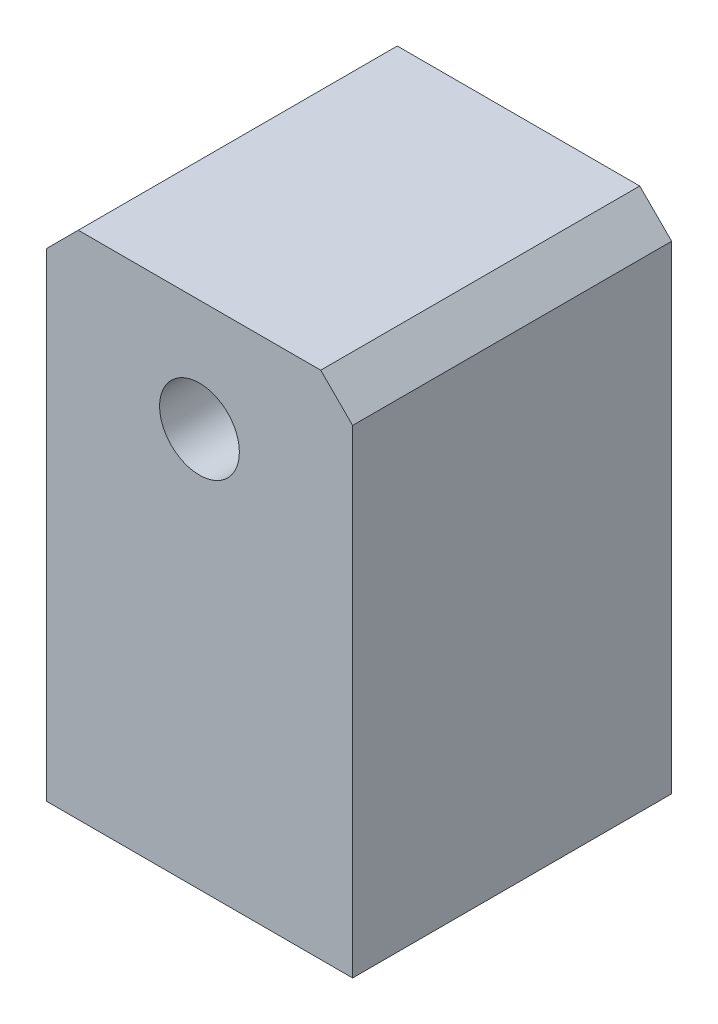
ISO-10303-21;
HEADER;
FILE_DESCRIPTION(('STEP AP214'),'2;1');
FILE_NAME('part.step','',(''),(''),'','','');
FILE_SCHEMA(('AUTOMOTIVE_DESIGN { 1 0 10303 214 1 1 1 1 }'));
ENDSEC;
DATA;
#1=APPLICATION_CONTEXT('core data for automotive mechanical design processes');
#2=APPLICATION_PROTOCOL_DEFINITION('international standard','automotive_design',2000,#1);
#3=PRODUCT_CONTEXT('',#1,'mechanical');
#4=PRODUCT('Part','Part','',(#3));
#5=PRODUCT_RELATED_PRODUCT_CATEGORY('part','',(#4));
#6=PRODUCT_DEFINITION_FORMATION('','',#4);
#7=PRODUCT_DEFINITION_CONTEXT('part definition',#1,'design');
#8=PRODUCT_DEFINITION('design','',#6,#7);
#9=PRODUCT_DEFINITION_SHAPE('','',#8);
#10=(LENGTH_UNIT() NAMED_UNIT(*) SI_UNIT(.MILLI.,.METRE.));
#11=(NAMED_UNIT(*) PLANE_ANGLE_UNIT() SI_UNIT($,.RADIAN.));
#12=(NAMED_UNIT(*) SI_UNIT($,.STERADIAN.) SOLID_ANGLE_UNIT());
#13=UNCERTAINTY_MEASURE_WITH_UNIT(LENGTH_MEASURE(1.E-05),#10,'distance_accuracy_value','');
#14=(GEOMETRIC_REPRESENTATION_CONTEXT(3) GLOBAL_UNCERTAINTY_ASSIGNED_CONTEXT((#13)) GLOBAL_UNIT_ASSIGNED_CONTEXT((#10,
#11,#12)) REPRESENTATION_CONTEXT('',''));
#15=CARTESIAN_POINT('',(0.,0.,0.));
#16=DIRECTION('',(0.,0.,1.));
#17=DIRECTION('',(1.,0.,0.));
#18=AXIS2_PLACEMENT_3D('',#15,#16,#17);
#19=CARTESIAN_POINT('',(-48.,0.,100.));
#20=DIRECTION('',(1.,0.,0.));
#21=DIRECTION('',(0.,0.,-1.));
#22=AXIS2_PLACEMENT_3D('',#19,#20,#21);
#23=PLANE('',#22);
#24=DIRECTION('',(0.,-1.,0.));
#25=VECTOR('',#24,1.);
#26=CARTESIAN_POINT('',(-48.,0.,100.));
#27=LINE('',#26,#25);
#28=CARTESIAN_POINT('',(-48.,150.,100.));
#29=VERTEX_POINT('',#28);
#30=CARTESIAN_POINT('',(-48.,0.,100.));
#31=VERTEX_POINT('',#30);
#32=EDGE_CURVE('E87',#29,#31,#27,.T.);
#33=ORIENTED_EDGE('',*,*,#32,.F.);
#34=DIRECTION('',(0.,0.,-1.));
#35=VECTOR('',#34,1.);
#36=CARTESIAN_POINT('',(-48.,150.,100.));
#37=LINE('',#36,#35);
#38=CARTESIAN_POINT('',(-48.,150.,0.));
#39=VERTEX_POINT('',#38);
#40=EDGE_CURVE('E11',#29,#39,#37,.T.);
#41=ORIENTED_EDGE('',*,*,#40,.T.);
#42=DIRECTION('',(0.,-1.,0.));
#43=VECTOR('',#42,1.);
#44=CARTESIAN_POINT('',(-48.,0.,0.));
#45=LINE('',#44,#43);
#46=CARTESIAN_POINT('',(-48.,0.,0.));
#47=VERTEX_POINT('',#46);
#48=EDGE_CURVE('E106',#39,#47,#45,.T.);
#49=ORIENTED_EDGE('',*,*,#48,.T.);
#50=DIRECTION('',(0.,0.,-1.));
#51=VECTOR('',#50,1.);
#52=CARTESIAN_POINT('',(-48.,0.,100.));
#53=LINE('',#52,#51);
#54=EDGE_CURVE('E100',#31,#47,#53,.T.);
#55=ORIENTED_EDGE('',*,*,#54,.F.);
#56=EDGE_LOOP('',(#33,#41,#49,#55));
#57=FACE_BOUND('',#56,.T.);
#58=ADVANCED_FACE('F34',(#57),#23,.F.);
#59=CARTESIAN_POINT('',(-48.,0.,100.));
#60=DIRECTION('',(0.,1.,0.));
#61=DIRECTION('',(-1.,0.,0.));
#62=AXIS2_PLACEMENT_3D('',#59,#60,#61);
#63=PLANE('',#62);
#64=DIRECTION('',(1.,0.,0.));
#65=VECTOR('',#64,1.);
#66=CARTESIAN_POINT('',(-48.,0.,0.));
#67=LINE('',#66,#65);
#68=CARTESIAN_POINT('',(48.,0.,0.));
#69=VERTEX_POINT('',#68);
#70=EDGE_CURVE('E139',#47,#69,#67,.T.);
#71=ORIENTED_EDGE('',*,*,#70,.T.);
#72=DIRECTION('',(0.,0.,-1.));
#73=VECTOR('',#72,1.);
#74=CARTESIAN_POINT('',(48.,0.,100.));
#75=LINE('',#74,#73);
#76=CARTESIAN_POINT('',(48.,0.,100.));
#77=VERTEX_POINT('',#76);
#78=EDGE_CURVE('E102',#77,#69,#75,.T.);
#79=ORIENTED_EDGE('',*,*,#78,.F.);
#80=DIRECTION('',(1.,0.,0.));
#81=VECTOR('',#80,1.);
#82=CARTESIAN_POINT('',(-48.,0.,100.));
#83=LINE('',#82,#81);
#84=EDGE_CURVE('E90',#31,#77,#83,.T.);
#85=ORIENTED_EDGE('',*,*,#84,.F.);
#86=ORIENTED_EDGE('',*,*,#54,.T.);
#87=EDGE_LOOP('',(#71,#79,#85,#86));
#88=FACE_BOUND('',#87,.T.);
#89=ADVANCED_FACE('F99',(#88),#63,.F.);
#90=CARTESIAN_POINT('',(48.,0.,100.));
#91=DIRECTION('',(-1.,0.,0.));
#92=DIRECTION('',(0.,0.,1.));
#93=AXIS2_PLACEMENT_3D('',#90,#91,#92);
#94=PLANE('',#93);
#95=DIRECTION('',(0.,1.,0.));
#96=VECTOR('',#95,1.);
#97=CARTESIAN_POINT('',(48.,0.,0.));
#98=LINE('',#97,#96);
#99=CARTESIAN_POINT('',(48.,150.,0.));
#100=VERTEX_POINT('',#99);
#101=EDGE_CURVE('E137',#69,#100,#98,.T.);
#102=ORIENTED_EDGE('',*,*,#101,.T.);
#103=DIRECTION('',(0.,0.,1.));
#104=VECTOR('',#103,1.);
#105=CARTESIAN_POINT('',(48.,150.,100.));
#106=LINE('',#105,#104);
#107=CARTESIAN_POINT('',(48.,150.,100.));
#108=VERTEX_POINT('',#107);
#109=EDGE_CURVE('E57',#100,#108,#106,.T.);
#110=ORIENTED_EDGE('',*,*,#109,.T.);
#111=DIRECTION('',(0.,1.,0.));
#112=VECTOR('',#111,1.);
#113=CARTESIAN_POINT('',(48.,0.,100.));
#114=LINE('',#113,#112);
#115=EDGE_CURVE('E103',#77,#108,#114,.T.);
#116=ORIENTED_EDGE('',*,*,#115,.F.);
#117=ORIENTED_EDGE('',*,*,#78,.T.);
#118=EDGE_LOOP('',(#102,#110,#116,#117));
#119=FACE_BOUND('',#118,.T.);
#120=ADVANCED_FACE('F138',(#119),#94,.F.);
#121=CARTESIAN_POINT('',(-48.,160.,100.));
#122=DIRECTION('',(0.,-1.,0.));
#123=DIRECTION('',(0.,0.,-1.));
#124=AXIS2_PLACEMENT_3D('',#121,#122,#123);
#125=PLANE('',#124);
#126=DIRECTION('',(-1.,0.,0.));
#127=VECTOR('',#126,1.);
#128=CARTESIAN_POINT('',(-48.,160.,100.));
#129=LINE('',#128,#127);
#130=CARTESIAN_POINT('',(38.,160.,100.));
#131=VERTEX_POINT('',#130);
#132=CARTESIAN_POINT('',(-38.,160.,100.));
#133=VERTEX_POINT('',#132);
#134=EDGE_CURVE('E112',#131,#133,#129,.T.);
#135=ORIENTED_EDGE('',*,*,#134,.F.);
#136=DIRECTION('',(0.,0.,-1.));
#137=VECTOR('',#136,1.);
#138=CARTESIAN_POINT('',(38.,160.,100.));
#139=LINE('',#138,#137);
#140=CARTESIAN_POINT('',(38.,160.,0.));
#141=VERTEX_POINT('',#140);
#142=EDGE_CURVE('E110',#131,#141,#139,.T.);
#143=ORIENTED_EDGE('',*,*,#142,.T.);
#144=DIRECTION('',(-1.,0.,0.));
#145=VECTOR('',#144,1.);
#146=CARTESIAN_POINT('',(-48.,160.,0.));
#147=LINE('',#146,#145);
#148=CARTESIAN_POINT('',(-38.,160.,0.));
#149=VERTEX_POINT('',#148);
#150=EDGE_CURVE('E95',#141,#149,#147,.T.);
#151=ORIENTED_EDGE('',*,*,#150,.T.);
#152=DIRECTION('',(0.,0.,1.));
#153=VECTOR('',#152,1.);
#154=CARTESIAN_POINT('',(-38.,160.,100.));
#155=LINE('',#154,#153);
#156=EDGE_CURVE('E108',#149,#133,#155,.T.);
#157=ORIENTED_EDGE('',*,*,#156,.T.);
#158=EDGE_LOOP('',(#135,#143,#151,#157));
#159=FACE_BOUND('',#158,.T.);
#160=ADVANCED_FACE('F128',(#159),#125,.F.);
#161=CARTESIAN_POINT('',(0.,0.,100.));
#162=DIRECTION('',(0.,0.,-1.));
#163=DIRECTION('',(-1.,0.,0.));
#164=AXIS2_PLACEMENT_3D('',#161,#162,#163);
#165=PLANE('',#164);
#166=CARTESIAN_POINT('',(0.,125.,100.));
#167=DIRECTION('',(0.,0.,1.));
#168=DIRECTION('',(1.,0.,0.));
#169=AXIS2_PLACEMENT_3D('',#166,#167,#168);
#170=CIRCLE('',#169,12.5);
#171=CARTESIAN_POINT('',(12.5,125.,100.));
#172=VERTEX_POINT('',#171);
#173=EDGE_CURVE('E146',#172,#172,#170,.T.);
#174=ORIENTED_EDGE('',*,*,#173,.F.);
#175=EDGE_LOOP('',(#174));
#176=FACE_BOUND('',#175,.T.);
#177=ORIENTED_EDGE('',*,*,#115,.T.);
#178=DIRECTION('',(0.707106781186547,-0.707106781186549,0.));
#179=VECTOR('',#178,1.);
#180=CARTESIAN_POINT('',(38.,160.,100.));
#181=LINE('',#180,#179);
#182=EDGE_CURVE('E42',#108,#131,#181,.F.);
#183=ORIENTED_EDGE('',*,*,#182,.T.);
#184=ORIENTED_EDGE('',*,*,#134,.T.);
#185=DIRECTION('',(0.707106781186548,0.707106781186547,0.));
#186=VECTOR('',#185,1.);
#187=CARTESIAN_POINT('',(-48.,150.,100.));
#188=LINE('',#187,#186);
#189=EDGE_CURVE('E49',#133,#29,#188,.F.);
#190=ORIENTED_EDGE('',*,*,#189,.T.);
#191=ORIENTED_EDGE('',*,*,#32,.T.);
#192=ORIENTED_EDGE('',*,*,#84,.T.);
#193=EDGE_LOOP('',(#177,#183,#184,#190,#191,#192));
#194=FACE_BOUND('',#193,.T.);
#195=ADVANCED_FACE('F89',(#176,#194),#165,.F.);
#196=CARTESIAN_POINT('',(0.,0.,0.));
#197=DIRECTION('',(0.,0.,-1.));
#198=DIRECTION('',(-1.,0.,0.));
#199=AXIS2_PLACEMENT_3D('',#196,#197,#198);
#200=PLANE('',#199);
#201=CARTESIAN_POINT('',(0.,125.,0.));
#202=DIRECTION('',(0.,0.,1.));
#203=DIRECTION('',(1.,0.,0.));
#204=AXIS2_PLACEMENT_3D('',#201,#202,#203);
#205=CIRCLE('',#204,12.5);
#206=CARTESIAN_POINT('',(12.5,125.,0.));
#207=VERTEX_POINT('',#206);
#208=EDGE_CURVE('E143',#207,#207,#205,.T.);
#209=ORIENTED_EDGE('',*,*,#208,.T.);
#210=EDGE_LOOP('',(#209));
#211=FACE_BOUND('',#210,.T.);
#212=ORIENTED_EDGE('',*,*,#150,.F.);
#213=DIRECTION('',(-0.707106781186547,0.707106781186549,0.));
#214=VECTOR('',#213,1.);
#215=CARTESIAN_POINT('',(99.0000000000001,98.9999999999998,0.));
#216=LINE('',#215,#214);
#217=EDGE_CURVE('E120',#141,#100,#216,.F.);
#218=ORIENTED_EDGE('',*,*,#217,.T.);
#219=ORIENTED_EDGE('',*,*,#101,.F.);
#220=ORIENTED_EDGE('',*,*,#70,.F.);
#221=ORIENTED_EDGE('',*,*,#48,.F.);
#222=DIRECTION('',(-0.707106781186548,-0.707106781186547,0.));
#223=VECTOR('',#222,1.);
#224=CARTESIAN_POINT('',(-99.,99.0000000000002,0.));
#225=LINE('',#224,#223);
#226=EDGE_CURVE('E118',#39,#149,#225,.F.);
#227=ORIENTED_EDGE('',*,*,#226,.T.);
#228=EDGE_LOOP('',(#212,#218,#219,#220,#221,#227));
#229=FACE_BOUND('',#228,.T.);
#230=ADVANCED_FACE('F136',(#211,#229),#200,.T.);
#231=CARTESIAN_POINT('',(0.,125.,0.));
#232=DIRECTION('',(0.,0.,1.));
#233=DIRECTION('',(1.,0.,0.));
#234=AXIS2_PLACEMENT_3D('',#231,#232,#233);
#235=CYLINDRICAL_SURFACE('',#234,12.5);
#236=ORIENTED_EDGE('',*,*,#208,.F.);
#237=EDGE_LOOP('',(#236));
#238=FACE_BOUND('',#237,.T.);
#239=ORIENTED_EDGE('',*,*,#173,.T.);
#240=EDGE_LOOP('',(#239));
#241=FACE_BOUND('',#240,.T.);
#242=ADVANCED_FACE('F153',(#238,#241),#235,.F.);
#243=CARTESIAN_POINT('',(38.,160.,100.));
#244=DIRECTION('',(-0.707106781186549,-0.707106781186547,0.));
#245=DIRECTION('',(0.,0.,-1.));
#246=AXIS2_PLACEMENT_3D('',#243,#244,#245);
#247=PLANE('',#246);
#248=ORIENTED_EDGE('',*,*,#182,.F.);
#249=ORIENTED_EDGE('',*,*,#109,.F.);
#250=ORIENTED_EDGE('',*,*,#217,.F.);
#251=ORIENTED_EDGE('',*,*,#142,.F.);
#252=EDGE_LOOP('',(#248,#249,#250,#251));
#253=FACE_BOUND('',#252,.T.);
#254=ADVANCED_FACE('F133',(#253),#247,.F.);
#255=CARTESIAN_POINT('',(-48.,150.,100.));
#256=DIRECTION('',(0.707106781186547,-0.707106781186548,0.));
#257=DIRECTION('',(0.,0.,-1.));
#258=AXIS2_PLACEMENT_3D('',#255,#256,#257);
#259=PLANE('',#258);
#260=ORIENTED_EDGE('',*,*,#189,.F.);
#261=ORIENTED_EDGE('',*,*,#156,.F.);
#262=ORIENTED_EDGE('',*,*,#226,.F.);
#263=ORIENTED_EDGE('',*,*,#40,.F.);
#264=EDGE_LOOP('',(#260,#261,#262,#263));
#265=FACE_BOUND('',#264,.T.);
#266=ADVANCED_FACE('F36',(#265),#259,.F.);
#267=CLOSED_SHELL('',(#58,#89,#120,#160,#195,#230,#242,#254,#266));
#268=MANIFOLD_SOLID_BREP('B2',#267);
#269=ADVANCED_BREP_SHAPE_REPRESENTATION('',(#18,#268),#14);
#270=SHAPE_DEFINITION_REPRESENTATION(#9,#269);
ENDSEC;
END-ISO-10303-21;
